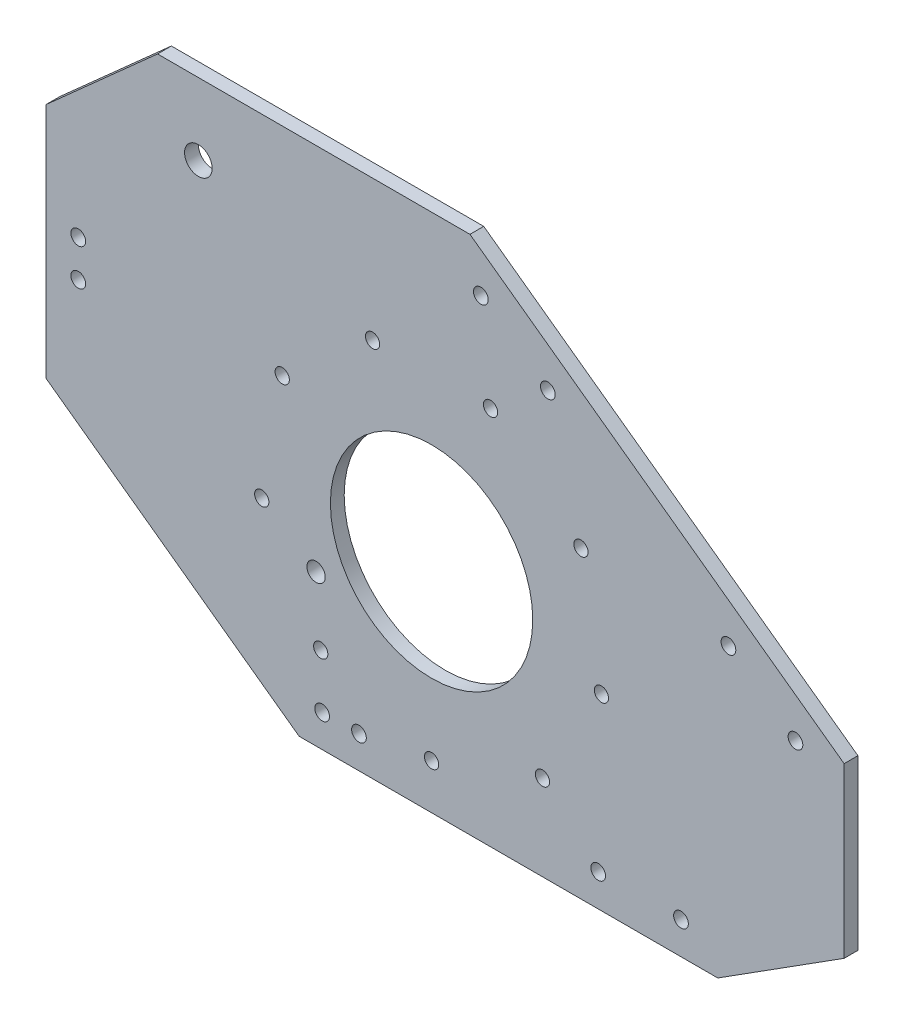
ISO-10303-21;
HEADER;
FILE_DESCRIPTION(('STEP AP214'),'2;1');
FILE_NAME('part.step','',(''),(''),'','','');
FILE_SCHEMA(('AUTOMOTIVE_DESIGN { 1 0 10303 214 1 1 1 1 }'));
ENDSEC;
DATA;
#1=APPLICATION_CONTEXT('core data for automotive mechanical design processes');
#2=APPLICATION_PROTOCOL_DEFINITION('international standard','automotive_design',2000,#1);
#3=PRODUCT_CONTEXT('',#1,'mechanical');
#4=PRODUCT('Part','Part','',(#3));
#5=PRODUCT_RELATED_PRODUCT_CATEGORY('part','',(#4));
#6=PRODUCT_DEFINITION_FORMATION('','',#4);
#7=PRODUCT_DEFINITION_CONTEXT('part definition',#1,'design');
#8=PRODUCT_DEFINITION('design','',#6,#7);
#9=PRODUCT_DEFINITION_SHAPE('','',#8);
#10=(LENGTH_UNIT() NAMED_UNIT(*) SI_UNIT(.MILLI.,.METRE.));
#11=(NAMED_UNIT(*) PLANE_ANGLE_UNIT() SI_UNIT($,.RADIAN.));
#12=(NAMED_UNIT(*) SI_UNIT($,.STERADIAN.) SOLID_ANGLE_UNIT());
#13=UNCERTAINTY_MEASURE_WITH_UNIT(LENGTH_MEASURE(1.E-05),#10,'distance_accuracy_value','');
#14=(GEOMETRIC_REPRESENTATION_CONTEXT(3) GLOBAL_UNCERTAINTY_ASSIGNED_CONTEXT((#13)) GLOBAL_UNIT_ASSIGNED_CONTEXT((#10,
#11,#12)) REPRESENTATION_CONTEXT('',''));
#15=CARTESIAN_POINT('',(0.,0.,0.));
#16=DIRECTION('',(0.,0.,1.));
#17=DIRECTION('',(1.,0.,0.));
#18=AXIS2_PLACEMENT_3D('',#15,#16,#17);
#19=CARTESIAN_POINT('',(0.,0.,-50.1117165948132));
#20=DIRECTION('',(0.,0.,-1.));
#21=DIRECTION('',(-1.,0.,0.));
#22=AXIS2_PLACEMENT_3D('',#19,#20,#21);
#23=PLANE('',#22);
#24=CARTESIAN_POINT('',(-12.8155102632688,9.25915524788277,-50.1117165948132));
#25=DIRECTION('',(0.,0.,-1.));
#26=DIRECTION('',(-1.,0.,0.));
#27=AXIS2_PLACEMENT_3D('',#24,#25,#26);
#28=CIRCLE('',#27,1.6);
#29=CARTESIAN_POINT('',(-14.4155102632688,9.25915524788277,-50.1117165948132));
#30=VERTEX_POINT('',#29);
#31=EDGE_CURVE('E390',#30,#30,#28,.T.);
#32=ORIENTED_EDGE('',*,*,#31,.F.);
#33=EDGE_LOOP('',(#32));
#34=FACE_BOUND('',#33,.T.);
#35=CARTESIAN_POINT('',(-20.8155102632688,9.25915524788277,-50.1117165948132));
#36=DIRECTION('',(0.,0.,-1.));
#37=DIRECTION('',(-1.,0.,0.));
#38=AXIS2_PLACEMENT_3D('',#35,#36,#37);
#39=CIRCLE('',#38,1.6);
#40=CARTESIAN_POINT('',(-22.4155102632688,9.25915524788277,-50.1117165948132));
#41=VERTEX_POINT('',#40);
#42=EDGE_CURVE('E386',#41,#41,#39,.T.);
#43=ORIENTED_EDGE('',*,*,#42,.F.);
#44=EDGE_LOOP('',(#43));
#45=FACE_BOUND('',#44,.T.);
#46=CARTESIAN_POINT('',(82.0999463845966,55.3937330616579,-50.1117165948132));
#47=DIRECTION('',(0.,0.,-1.));
#48=DIRECTION('',(-1.,0.,0.));
#49=AXIS2_PLACEMENT_3D('',#46,#47,#48);
#50=CIRCLE('',#49,1.60000000000001);
#51=CARTESIAN_POINT('',(80.4999463845966,55.3937330616579,-50.1117165948132));
#52=VERTEX_POINT('',#51);
#53=EDGE_CURVE('E375',#52,#52,#50,.T.);
#54=ORIENTED_EDGE('',*,*,#53,.F.);
#55=EDGE_LOOP('',(#54));
#56=FACE_BOUND('',#55,.T.);
#57=CARTESIAN_POINT('',(67.5275152985397,65.959917436451,-50.1117165948132));
#58=DIRECTION('',(0.,0.,-1.));
#59=DIRECTION('',(-1.,0.,0.));
#60=AXIS2_PLACEMENT_3D('',#57,#58,#59);
#61=CIRCLE('',#60,1.60000000000001);
#62=CARTESIAN_POINT('',(65.9275152985397,65.959917436451,-50.1117165948132));
#63=VERTEX_POINT('',#62);
#64=EDGE_CURVE('E371',#63,#63,#61,.T.);
#65=ORIENTED_EDGE('',*,*,#64,.F.);
#66=EDGE_LOOP('',(#65));
#67=FACE_BOUND('',#66,.T.);
#68=CARTESIAN_POINT('',(28.2620541972344,94.4305342544385,-50.1117165948132));
#69=DIRECTION('',(0.,0.,-1.));
#70=DIRECTION('',(-1.,0.,0.));
#71=AXIS2_PLACEMENT_3D('',#68,#69,#70);
#72=CIRCLE('',#71,1.6);
#73=CARTESIAN_POINT('',(26.6620541972344,94.4305342544385,-50.1117165948132));
#74=VERTEX_POINT('',#73);
#75=EDGE_CURVE('E363',#74,#74,#72,.T.);
#76=ORIENTED_EDGE('',*,*,#75,.F.);
#77=EDGE_LOOP('',(#76));
#78=FACE_BOUND('',#77,.T.);
#79=CARTESIAN_POINT('',(13.6896231111775,104.996718629232,-50.1117165948132));
#80=DIRECTION('',(0.,0.,-1.));
#81=DIRECTION('',(-1.,0.,0.));
#82=AXIS2_PLACEMENT_3D('',#79,#80,#81);
#83=CIRCLE('',#82,1.6);
#84=CARTESIAN_POINT('',(12.0896231111775,104.996718629232,-50.1117165948132));
#85=VERTEX_POINT('',#84);
#86=EDGE_CURVE('E354',#85,#85,#83,.T.);
#87=ORIENTED_EDGE('',*,*,#86,.F.);
#88=EDGE_LOOP('',(#87));
#89=FACE_BOUND('',#88,.T.);
#90=CARTESIAN_POINT('',(-73.8480972320264,72.2182566094569,-50.1117165948132));
#91=DIRECTION('',(0.,0.,-1.));
#92=DIRECTION('',(-1.,0.,0.));
#93=AXIS2_PLACEMENT_3D('',#90,#91,#92);
#94=CIRCLE('',#93,1.60000000000001);
#95=CARTESIAN_POINT('',(-75.4480972320264,72.2182566094569,-50.1117165948132));
#96=VERTEX_POINT('',#95);
#97=EDGE_CURVE('E343',#96,#96,#94,.T.);
#98=ORIENTED_EDGE('',*,*,#97,.F.);
#99=EDGE_LOOP('',(#98));
#100=FACE_BOUND('',#99,.T.);
#101=CARTESIAN_POINT('',(-73.8480972320264,64.2182566094569,-50.1117165948132));
#102=DIRECTION('',(0.,0.,-1.));
#103=DIRECTION('',(-1.,0.,0.));
#104=AXIS2_PLACEMENT_3D('',#101,#102,#103);
#105=CIRCLE('',#104,1.60000000000001);
#106=CARTESIAN_POINT('',(-75.4480972320264,64.2182566094569,-50.1117165948132));
#107=VERTEX_POINT('',#106);
#108=EDGE_CURVE('E338',#107,#107,#105,.T.);
#109=ORIENTED_EDGE('',*,*,#108,.F.);
#110=EDGE_LOOP('',(#109));
#111=FACE_BOUND('',#110,.T.);
#112=CARTESIAN_POINT('',(-33.9536941492373,43.0627713366464,-50.1117165948132));
#113=DIRECTION('',(0.,0.,-1.));
#114=DIRECTION('',(-1.,0.,0.));
#115=AXIS2_PLACEMENT_3D('',#112,#113,#114);
#116=CIRCLE('',#115,1.5503360640483);
#117=CARTESIAN_POINT('',(-35.5040302132856,43.0627713366464,-50.1117165948132));
#118=VERTEX_POINT('',#117);
#119=EDGE_CURVE('E290',#118,#118,#116,.T.);
#120=ORIENTED_EDGE('',*,*,#119,.F.);
#121=EDGE_LOOP('',(#120));
#122=FACE_BOUND('',#121,.T.);
#123=CARTESIAN_POINT('',(-29.4991855871602,68.3236111641728,-50.1117165948132));
#124=DIRECTION('',(0.,0.,-1.));
#125=DIRECTION('',(-1.,0.,0.));
#126=AXIS2_PLACEMENT_3D('',#123,#124,#125);
#127=CIRCLE('',#126,1.55033606404831);
#128=CARTESIAN_POINT('',(-31.0495216512085,68.3236111641728,-50.1117165948132));
#129=VERTEX_POINT('',#128);
#130=EDGE_CURVE('E299',#129,#129,#127,.T.);
#131=ORIENTED_EDGE('',*,*,#130,.F.);
#132=EDGE_LOOP('',(#131));
#133=FACE_BOUND('',#132,.T.);
#134=CARTESIAN_POINT('',(-9.84898831995296,84.812084443644,-50.1117165948132));
#135=DIRECTION('',(0.,0.,-1.));
#136=DIRECTION('',(-1.,0.,0.));
#137=AXIS2_PLACEMENT_3D('',#134,#135,#136);
#138=CIRCLE('',#137,1.55033606404831);
#139=CARTESIAN_POINT('',(-11.3993243840013,84.812084443644,-50.1117165948132));
#140=VERTEX_POINT('',#139);
#141=EDGE_CURVE('E307',#140,#140,#138,.T.);
#142=ORIENTED_EDGE('',*,*,#141,.F.);
#143=EDGE_LOOP('',(#142));
#144=FACE_BOUND('',#143,.T.);
#145=CARTESIAN_POINT('',(15.8025224294753,84.8120844436449,-50.1117165948132));
#146=DIRECTION('',(0.,0.,-1.));
#147=DIRECTION('',(-1.,0.,0.));
#148=AXIS2_PLACEMENT_3D('',#145,#146,#147);
#149=CIRCLE('',#148,1.55033606404831);
#150=CARTESIAN_POINT('',(14.252186365427,84.8120844436449,-50.1117165948132));
#151=VERTEX_POINT('',#150);
#152=EDGE_CURVE('E259',#151,#151,#149,.T.);
#153=ORIENTED_EDGE('',*,*,#152,.F.);
#154=EDGE_LOOP('',(#153));
#155=FACE_BOUND('',#154,.T.);
#156=CARTESIAN_POINT('',(35.4527196966758,68.3236111641708,-50.1117165948132));
#157=DIRECTION('',(0.,0.,-1.));
#158=DIRECTION('',(-1.,0.,0.));
#159=AXIS2_PLACEMENT_3D('',#156,#157,#158);
#160=CIRCLE('',#159,1.55033606404831);
#161=CARTESIAN_POINT('',(33.9023836326275,68.3236111641708,-50.1117165948132));
#162=VERTEX_POINT('',#161);
#163=EDGE_CURVE('E258',#162,#162,#160,.T.);
#164=ORIENTED_EDGE('',*,*,#163,.F.);
#165=EDGE_LOOP('',(#164));
#166=FACE_BOUND('',#165,.T.);
#167=CARTESIAN_POINT('',(39.9070577927147,43.061804501661,-50.1117165948132));
#168=DIRECTION('',(0.,0.,-1.));
#169=DIRECTION('',(-1.,0.,0.));
#170=AXIS2_PLACEMENT_3D('',#167,#168,#169);
#171=CIRCLE('',#170,1.55033606404832);
#172=CARTESIAN_POINT('',(38.3567217286664,43.061804501661,-50.1117165948132));
#173=VERTEX_POINT('',#172);
#174=EDGE_CURVE('E267',#173,#173,#171,.T.);
#175=ORIENTED_EDGE('',*,*,#174,.F.);
#176=EDGE_LOOP('',(#175));
#177=FACE_BOUND('',#176,.T.);
#178=CARTESIAN_POINT('',(27.0813024180058,20.8469445472107,-50.1117165948132));
#179=DIRECTION('',(0.,0.,-1.));
#180=DIRECTION('',(-1.,0.,0.));
#181=AXIS2_PLACEMENT_3D('',#178,#179,#180);
#182=CIRCLE('',#181,1.55033606404831);
#183=CARTESIAN_POINT('',(25.5309663539575,20.8469445472107,-50.1117165948132));
#184=VERTEX_POINT('',#183);
#185=EDGE_CURVE('E275',#184,#184,#182,.T.);
#186=ORIENTED_EDGE('',*,*,#185,.F.);
#187=EDGE_LOOP('',(#186));
#188=FACE_BOUND('',#187,.T.);
#189=CARTESIAN_POINT('',(2.9767670547193,12.0736111641782,-50.1117165948132));
#190=DIRECTION('',(0.,0.,-1.));
#191=DIRECTION('',(-1.,0.,0.));
#192=AXIS2_PLACEMENT_3D('',#189,#190,#191);
#193=CIRCLE('',#192,1.55033606404831);
#194=CARTESIAN_POINT('',(1.42643099067099,12.0736111641782,-50.1117165948132));
#195=VERTEX_POINT('',#194);
#196=EDGE_CURVE('E250',#195,#195,#193,.T.);
#197=ORIENTED_EDGE('',*,*,#196,.F.);
#198=EDGE_LOOP('',(#197));
#199=FACE_BOUND('',#198,.T.);
#200=CARTESIAN_POINT('',(57.2049606735181,9.25915524788276,-50.1117165948132));
#201=DIRECTION('',(0.,0.,-1.));
#202=DIRECTION('',(-1.,0.,0.));
#203=AXIS2_PLACEMENT_3D('',#200,#201,#202);
#204=CIRCLE('',#203,1.6);
#205=CARTESIAN_POINT('',(55.6049606735181,9.25915524788276,-50.1117165948132));
#206=VERTEX_POINT('',#205);
#207=EDGE_CURVE('E291',#206,#206,#204,.T.);
#208=ORIENTED_EDGE('',*,*,#207,.F.);
#209=EDGE_LOOP('',(#208));
#210=FACE_BOUND('',#209,.T.);
#211=CARTESIAN_POINT('',(39.2049606735181,9.25915524788276,-50.1117165948132));
#212=DIRECTION('',(0.,0.,-1.));
#213=DIRECTION('',(-1.,0.,0.));
#214=AXIS2_PLACEMENT_3D('',#211,#212,#213);
#215=CIRCLE('',#214,1.6);
#216=CARTESIAN_POINT('',(37.6049606735181,9.25915524788276,-50.1117165948132));
#217=VERTEX_POINT('',#216);
#218=EDGE_CURVE('E322',#217,#217,#215,.T.);
#219=ORIENTED_EDGE('',*,*,#218,.F.);
#220=EDGE_LOOP('',(#219));
#221=FACE_BOUND('',#220,.T.);
#222=CARTESIAN_POINT('',(-21.1277683084835,20.8469445472107,-50.1117165948132));
#223=DIRECTION('',(0.,0.,-1.));
#224=DIRECTION('',(-1.,0.,0.));
#225=AXIS2_PLACEMENT_3D('',#222,#223,#224);
#226=CIRCLE('',#225,1.5503360640483);
#227=CARTESIAN_POINT('',(-22.6781043725318,20.8469445472107,-50.1117165948132));
#228=VERTEX_POINT('',#227);
#229=EDGE_CURVE('E246',#228,#228,#226,.T.);
#230=ORIENTED_EDGE('',*,*,#229,.F.);
#231=EDGE_LOOP('',(#230));
#232=FACE_BOUND('',#231,.T.);
#233=CARTESIAN_POINT('',(-47.7332329452381,99.7336111641753,-50.1117165948132));
#234=DIRECTION('',(0.,0.,-1.));
#235=DIRECTION('',(-1.,0.,0.));
#236=AXIS2_PLACEMENT_3D('',#233,#234,#235);
#237=CIRCLE('',#236,3.00000000000001);
#238=CARTESIAN_POINT('',(-50.7332329452381,99.7336111641753,-50.1117165948132));
#239=VERTEX_POINT('',#238);
#240=EDGE_CURVE('E238',#239,#239,#237,.T.);
#241=ORIENTED_EDGE('',*,*,#240,.F.);
#242=EDGE_LOOP('',(#241));
#243=FACE_BOUND('',#242,.T.);
#244=CARTESIAN_POINT('',(2.97676705476189,49.5736111641754,-50.1117165948132));
#245=DIRECTION('',(0.,0.,-1.));
#246=DIRECTION('',(-1.,0.,0.));
#247=AXIS2_PLACEMENT_3D('',#244,#245,#246);
#248=CIRCLE('',#247,22.);
#249=CARTESIAN_POINT('',(-19.0232329452381,49.5736111641754,-50.1117165948132));
#250=VERTEX_POINT('',#249);
#251=EDGE_CURVE('E157',#250,#250,#248,.T.);
#252=ORIENTED_EDGE('',*,*,#251,.F.);
#253=EDGE_LOOP('',(#252));
#254=FACE_BOUND('',#253,.T.);
#255=DIRECTION('',(0.809579504780941,-0.58701024304406,0.));
#256=VECTOR('',#255,1.);
#257=CARTESIAN_POINT('',(11.3220587742384,115.359857107051,-50.1117165948132));
#258=LINE('',#257,#256);
#259=CARTESIAN_POINT('',(11.3220587742384,115.359857107051,-50.1117165948132));
#260=VERTEX_POINT('',#259);
#261=CARTESIAN_POINT('',(92.6856541241525,56.364707650772,-50.1117165948132));
#262=VERTEX_POINT('',#261);
#263=EDGE_CURVE('E175',#260,#262,#258,.T.);
#264=ORIENTED_EDGE('',*,*,#263,.T.);
#265=DIRECTION('',(0.,-1.,0.));
#266=VECTOR('',#265,1.);
#267=CARTESIAN_POINT('',(92.6856541241525,56.364707650772,-50.1117165948132));
#268=LINE('',#267,#266);
#269=CARTESIAN_POINT('',(92.6856541241525,19.6988260915546,-50.1117165948132));
#270=VERTEX_POINT('',#269);
#271=EDGE_CURVE('E110',#262,#270,#268,.T.);
#272=ORIENTED_EDGE('',*,*,#271,.T.);
#273=DIRECTION('',(-0.844329420182934,-0.535824439731477,0.));
#274=VECTOR('',#273,1.);
#275=CARTESIAN_POINT('',(92.6856541241525,19.6988260915546,-50.1117165948132));
#276=LINE('',#275,#274);
#277=CARTESIAN_POINT('',(65.2049606735181,2.25915524788277,-50.1117165948132));
#278=VERTEX_POINT('',#277);
#279=EDGE_CURVE('E197',#270,#278,#276,.T.);
#280=ORIENTED_EDGE('',*,*,#279,.T.);
#281=DIRECTION('',(-1.,0.,0.));
#282=VECTOR('',#281,1.);
#283=CARTESIAN_POINT('',(65.2049606735181,2.25915524788277,-50.1117165948132));
#284=LINE('',#283,#282);
#285=CARTESIAN_POINT('',(-25.8155102632688,2.25915524788277,-50.1117165948132));
#286=VERTEX_POINT('',#285);
#287=EDGE_CURVE('E211',#278,#286,#284,.T.);
#288=ORIENTED_EDGE('',*,*,#287,.T.);
#289=DIRECTION('',(-0.809736570052635,0.586793564313204,0.));
#290=VECTOR('',#289,1.);
#291=CARTESIAN_POINT('',(-25.8155102632688,2.25915524788277,-50.1117165948132));
#292=LINE('',#291,#290);
#293=CARTESIAN_POINT('',(-80.8480972320265,42.139739940599,-50.1117165948132));
#294=VERTEX_POINT('',#293);
#295=EDGE_CURVE('E129',#286,#294,#292,.T.);
#296=ORIENTED_EDGE('',*,*,#295,.T.);
#297=DIRECTION('',(0.,1.,0.));
#298=VECTOR('',#297,1.);
#299=CARTESIAN_POINT('',(-80.8480972320265,93.7182566094569,-50.1117165948132));
#300=LINE('',#299,#298);
#301=CARTESIAN_POINT('',(-80.8480972320265,93.7182566094569,-50.1117165948132));
#302=VERTEX_POINT('',#301);
#303=EDGE_CURVE('E123',#294,#302,#300,.T.);
#304=ORIENTED_EDGE('',*,*,#303,.T.);
#305=DIRECTION('',(0.746058084317605,0.665880871345878,0.));
#306=VECTOR('',#305,1.);
#307=CARTESIAN_POINT('',(-56.6006804588615,115.359857107051,-50.1117165948132));
#308=LINE('',#307,#306);
#309=CARTESIAN_POINT('',(-56.6006804588615,115.359857107051,-50.1117165948132));
#310=VERTEX_POINT('',#309);
#311=EDGE_CURVE('E127',#302,#310,#308,.T.);
#312=ORIENTED_EDGE('',*,*,#311,.T.);
#313=DIRECTION('',(1.,0.,0.));
#314=VECTOR('',#313,1.);
#315=CARTESIAN_POINT('',(11.3220587742384,115.359857107051,-50.1117165948132));
#316=LINE('',#315,#314);
#317=EDGE_CURVE('E67',#310,#260,#316,.T.);
#318=ORIENTED_EDGE('',*,*,#317,.T.);
#319=EDGE_LOOP('',(#264,#272,#280,#288,#296,#304,#312,#318));
#320=FACE_BOUND('',#319,.T.);
#321=CARTESIAN_POINT('',(-22.1383176912497,35.0742139973809,-50.1117165948132));
#322=DIRECTION('',(0.,0.,-1.));
#323=DIRECTION('',(-1.,0.,0.));
#324=AXIS2_PLACEMENT_3D('',#321,#322,#323);
#325=CIRCLE('',#324,1.9999999999959);
#326=CARTESIAN_POINT('',(-24.1383176912456,35.0742139973809,-50.1117165948132));
#327=VERTEX_POINT('',#326);
#328=EDGE_CURVE('E226',#327,#327,#325,.T.);
#329=ORIENTED_EDGE('',*,*,#328,.F.);
#330=EDGE_LOOP('',(#329));
#331=FACE_BOUND('',#330,.T.);
#332=ADVANCED_FACE('F49',(#34,#45,#56,#67,#78,#89,#100,#111,#122,#133,#144,#155,#166,#177,#188,
#199,#210,#221,#232,#243,#254,#320,#331),#23,.T.);
#333=CARTESIAN_POINT('',(0.,0.,-47.1117165948132));
#334=DIRECTION('',(0.,0.,-1.));
#335=DIRECTION('',(-1.,0.,0.));
#336=AXIS2_PLACEMENT_3D('',#333,#334,#335);
#337=PLANE('',#336);
#338=CARTESIAN_POINT('',(-12.8155102632688,9.25915524788277,-47.1117165948132));
#339=DIRECTION('',(0.,0.,-1.));
#340=DIRECTION('',(-1.,0.,0.));
#341=AXIS2_PLACEMENT_3D('',#338,#339,#340);
#342=CIRCLE('',#341,1.6);
#343=CARTESIAN_POINT('',(-14.4155102632688,9.25915524788277,-47.1117165948132));
#344=VERTEX_POINT('',#343);
#345=EDGE_CURVE('E355',#344,#344,#342,.T.);
#346=ORIENTED_EDGE('',*,*,#345,.T.);
#347=EDGE_LOOP('',(#346));
#348=FACE_BOUND('',#347,.T.);
#349=CARTESIAN_POINT('',(-20.8155102632688,9.25915524788277,-47.1117165948132));
#350=DIRECTION('',(0.,0.,-1.));
#351=DIRECTION('',(-1.,0.,0.));
#352=AXIS2_PLACEMENT_3D('',#349,#350,#351);
#353=CIRCLE('',#352,1.6);
#354=CARTESIAN_POINT('',(-22.4155102632688,9.25915524788277,-47.1117165948132));
#355=VERTEX_POINT('',#354);
#356=EDGE_CURVE('E382',#355,#355,#353,.T.);
#357=ORIENTED_EDGE('',*,*,#356,.T.);
#358=EDGE_LOOP('',(#357));
#359=FACE_BOUND('',#358,.T.);
#360=CARTESIAN_POINT('',(82.0999463845966,55.3937330616579,-47.1117165948132));
#361=DIRECTION('',(0.,0.,-1.));
#362=DIRECTION('',(-1.,0.,0.));
#363=AXIS2_PLACEMENT_3D('',#360,#361,#362);
#364=CIRCLE('',#363,1.60000000000001);
#365=CARTESIAN_POINT('',(80.4999463845966,55.3937330616579,-47.1117165948132));
#366=VERTEX_POINT('',#365);
#367=EDGE_CURVE('E339',#366,#366,#364,.T.);
#368=ORIENTED_EDGE('',*,*,#367,.T.);
#369=EDGE_LOOP('',(#368));
#370=FACE_BOUND('',#369,.T.);
#371=CARTESIAN_POINT('',(67.5275152985397,65.959917436451,-47.1117165948132));
#372=DIRECTION('',(0.,0.,-1.));
#373=DIRECTION('',(-1.,0.,0.));
#374=AXIS2_PLACEMENT_3D('',#371,#372,#373);
#375=CIRCLE('',#374,1.60000000000001);
#376=CARTESIAN_POINT('',(65.9275152985397,65.959917436451,-47.1117165948132));
#377=VERTEX_POINT('',#376);
#378=EDGE_CURVE('E367',#377,#377,#375,.T.);
#379=ORIENTED_EDGE('',*,*,#378,.T.);
#380=EDGE_LOOP('',(#379));
#381=FACE_BOUND('',#380,.T.);
#382=CARTESIAN_POINT('',(28.2620541972344,94.4305342544385,-47.1117165948132));
#383=DIRECTION('',(0.,0.,-1.));
#384=DIRECTION('',(-1.,0.,0.));
#385=AXIS2_PLACEMENT_3D('',#382,#383,#384);
#386=CIRCLE('',#385,1.6);
#387=CARTESIAN_POINT('',(26.6620541972344,94.4305342544385,-47.1117165948132));
#388=VERTEX_POINT('',#387);
#389=EDGE_CURVE('E359',#388,#388,#386,.T.);
#390=ORIENTED_EDGE('',*,*,#389,.T.);
#391=EDGE_LOOP('',(#390));
#392=FACE_BOUND('',#391,.T.);
#393=CARTESIAN_POINT('',(13.6896231111775,104.996718629232,-47.1117165948132));
#394=DIRECTION('',(0.,0.,-1.));
#395=DIRECTION('',(-1.,0.,0.));
#396=AXIS2_PLACEMENT_3D('',#393,#394,#395);
#397=CIRCLE('',#396,1.6);
#398=CARTESIAN_POINT('',(12.0896231111775,104.996718629232,-47.1117165948132));
#399=VERTEX_POINT('',#398);
#400=EDGE_CURVE('E350',#399,#399,#397,.T.);
#401=ORIENTED_EDGE('',*,*,#400,.T.);
#402=EDGE_LOOP('',(#401));
#403=FACE_BOUND('',#402,.T.);
#404=CARTESIAN_POINT('',(-73.8480972320264,72.2182566094569,-47.1117165948132));
#405=DIRECTION('',(0.,0.,-1.));
#406=DIRECTION('',(-1.,0.,0.));
#407=AXIS2_PLACEMENT_3D('',#404,#405,#406);
#408=CIRCLE('',#407,1.60000000000001);
#409=CARTESIAN_POINT('',(-75.4480972320264,72.2182566094569,-47.1117165948132));
#410=VERTEX_POINT('',#409);
#411=EDGE_CURVE('E323',#410,#410,#408,.T.);
#412=ORIENTED_EDGE('',*,*,#411,.T.);
#413=EDGE_LOOP('',(#412));
#414=FACE_BOUND('',#413,.T.);
#415=CARTESIAN_POINT('',(-73.8480972320264,64.2182566094569,-47.1117165948132));
#416=DIRECTION('',(0.,0.,-1.));
#417=DIRECTION('',(-1.,0.,0.));
#418=AXIS2_PLACEMENT_3D('',#415,#416,#417);
#419=CIRCLE('',#418,1.60000000000001);
#420=CARTESIAN_POINT('',(-75.4480972320264,64.2182566094569,-47.1117165948132));
#421=VERTEX_POINT('',#420);
#422=EDGE_CURVE('E334',#421,#421,#419,.T.);
#423=ORIENTED_EDGE('',*,*,#422,.T.);
#424=EDGE_LOOP('',(#423));
#425=FACE_BOUND('',#424,.T.);
#426=CARTESIAN_POINT('',(-33.9536941492373,43.0627713366464,-47.1117165948132));
#427=DIRECTION('',(0.,0.,-1.));
#428=DIRECTION('',(-1.,0.,0.));
#429=AXIS2_PLACEMENT_3D('',#426,#427,#428);
#430=CIRCLE('',#429,1.5503360640483);
#431=CARTESIAN_POINT('',(-35.5040302132856,43.0627713366464,-47.1117165948132));
#432=VERTEX_POINT('',#431);
#433=EDGE_CURVE('E286',#432,#432,#430,.T.);
#434=ORIENTED_EDGE('',*,*,#433,.T.);
#435=EDGE_LOOP('',(#434));
#436=FACE_BOUND('',#435,.T.);
#437=CARTESIAN_POINT('',(-29.4991855871602,68.3236111641728,-47.1117165948132));
#438=DIRECTION('',(0.,0.,-1.));
#439=DIRECTION('',(-1.,0.,0.));
#440=AXIS2_PLACEMENT_3D('',#437,#438,#439);
#441=CIRCLE('',#440,1.55033606404831);
#442=CARTESIAN_POINT('',(-31.0495216512085,68.3236111641728,-47.1117165948132));
#443=VERTEX_POINT('',#442);
#444=EDGE_CURVE('E295',#443,#443,#441,.T.);
#445=ORIENTED_EDGE('',*,*,#444,.T.);
#446=EDGE_LOOP('',(#445));
#447=FACE_BOUND('',#446,.T.);
#448=CARTESIAN_POINT('',(-9.84898831995296,84.812084443644,-47.1117165948132));
#449=DIRECTION('',(0.,0.,-1.));
#450=DIRECTION('',(-1.,0.,0.));
#451=AXIS2_PLACEMENT_3D('',#448,#449,#450);
#452=CIRCLE('',#451,1.55033606404831);
#453=CARTESIAN_POINT('',(-11.3993243840013,84.812084443644,-47.1117165948132));
#454=VERTEX_POINT('',#453);
#455=EDGE_CURVE('E303',#454,#454,#452,.T.);
#456=ORIENTED_EDGE('',*,*,#455,.T.);
#457=EDGE_LOOP('',(#456));
#458=FACE_BOUND('',#457,.T.);
#459=CARTESIAN_POINT('',(15.8025224294753,84.8120844436449,-47.1117165948132));
#460=DIRECTION('',(0.,0.,-1.));
#461=DIRECTION('',(-1.,0.,0.));
#462=AXIS2_PLACEMENT_3D('',#459,#460,#461);
#463=CIRCLE('',#462,1.55033606404831);
#464=CARTESIAN_POINT('',(14.252186365427,84.8120844436449,-47.1117165948132));
#465=VERTEX_POINT('',#464);
#466=EDGE_CURVE('E311',#465,#465,#463,.T.);
#467=ORIENTED_EDGE('',*,*,#466,.T.);
#468=EDGE_LOOP('',(#467));
#469=FACE_BOUND('',#468,.T.);
#470=CARTESIAN_POINT('',(35.4527196966758,68.3236111641708,-47.1117165948132));
#471=DIRECTION('',(0.,0.,-1.));
#472=DIRECTION('',(-1.,0.,0.));
#473=AXIS2_PLACEMENT_3D('',#470,#471,#472);
#474=CIRCLE('',#473,1.55033606404831);
#475=CARTESIAN_POINT('',(33.9023836326275,68.3236111641708,-47.1117165948132));
#476=VERTEX_POINT('',#475);
#477=EDGE_CURVE('E254',#476,#476,#474,.T.);
#478=ORIENTED_EDGE('',*,*,#477,.T.);
#479=EDGE_LOOP('',(#478));
#480=FACE_BOUND('',#479,.T.);
#481=CARTESIAN_POINT('',(39.9070577927147,43.061804501661,-47.1117165948132));
#482=DIRECTION('',(0.,0.,-1.));
#483=DIRECTION('',(-1.,0.,0.));
#484=AXIS2_PLACEMENT_3D('',#481,#482,#483);
#485=CIRCLE('',#484,1.55033606404832);
#486=CARTESIAN_POINT('',(38.3567217286664,43.061804501661,-47.1117165948132));
#487=VERTEX_POINT('',#486);
#488=EDGE_CURVE('E263',#487,#487,#485,.T.);
#489=ORIENTED_EDGE('',*,*,#488,.T.);
#490=EDGE_LOOP('',(#489));
#491=FACE_BOUND('',#490,.T.);
#492=CARTESIAN_POINT('',(27.0813024180058,20.8469445472107,-47.1117165948132));
#493=DIRECTION('',(0.,0.,-1.));
#494=DIRECTION('',(-1.,0.,0.));
#495=AXIS2_PLACEMENT_3D('',#492,#493,#494);
#496=CIRCLE('',#495,1.55033606404831);
#497=CARTESIAN_POINT('',(25.5309663539575,20.8469445472107,-47.1117165948132));
#498=VERTEX_POINT('',#497);
#499=EDGE_CURVE('E271',#498,#498,#496,.T.);
#500=ORIENTED_EDGE('',*,*,#499,.T.);
#501=EDGE_LOOP('',(#500));
#502=FACE_BOUND('',#501,.T.);
#503=CARTESIAN_POINT('',(2.9767670547193,12.0736111641782,-47.1117165948132));
#504=DIRECTION('',(0.,0.,-1.));
#505=DIRECTION('',(-1.,0.,0.));
#506=AXIS2_PLACEMENT_3D('',#503,#504,#505);
#507=CIRCLE('',#506,1.55033606404831);
#508=CARTESIAN_POINT('',(1.42643099067099,12.0736111641782,-47.1117165948132));
#509=VERTEX_POINT('',#508);
#510=EDGE_CURVE('E279',#509,#509,#507,.T.);
#511=ORIENTED_EDGE('',*,*,#510,.T.);
#512=EDGE_LOOP('',(#511));
#513=FACE_BOUND('',#512,.T.);
#514=CARTESIAN_POINT('',(57.2049606735181,9.25915524788276,-47.1117165948132));
#515=DIRECTION('',(0.,0.,-1.));
#516=DIRECTION('',(-1.,0.,0.));
#517=AXIS2_PLACEMENT_3D('',#514,#515,#516);
#518=CIRCLE('',#517,1.6);
#519=CARTESIAN_POINT('',(55.6049606735181,9.25915524788276,-47.1117165948132));
#520=VERTEX_POINT('',#519);
#521=EDGE_CURVE('E327',#520,#520,#518,.T.);
#522=ORIENTED_EDGE('',*,*,#521,.T.);
#523=EDGE_LOOP('',(#522));
#524=FACE_BOUND('',#523,.T.);
#525=CARTESIAN_POINT('',(39.2049606735181,9.25915524788276,-47.1117165948132));
#526=DIRECTION('',(0.,0.,-1.));
#527=DIRECTION('',(-1.,0.,0.));
#528=AXIS2_PLACEMENT_3D('',#525,#526,#527);
#529=CIRCLE('',#528,1.6);
#530=CARTESIAN_POINT('',(37.6049606735181,9.25915524788276,-47.1117165948132));
#531=VERTEX_POINT('',#530);
#532=EDGE_CURVE('E318',#531,#531,#529,.T.);
#533=ORIENTED_EDGE('',*,*,#532,.T.);
#534=EDGE_LOOP('',(#533));
#535=FACE_BOUND('',#534,.T.);
#536=CARTESIAN_POINT('',(-21.1277683084835,20.8469445472107,-47.1117165948132));
#537=DIRECTION('',(0.,0.,-1.));
#538=DIRECTION('',(-1.,0.,0.));
#539=AXIS2_PLACEMENT_3D('',#536,#537,#538);
#540=CIRCLE('',#539,1.5503360640483);
#541=CARTESIAN_POINT('',(-22.6781043725318,20.8469445472107,-47.1117165948132));
#542=VERTEX_POINT('',#541);
#543=EDGE_CURVE('E242',#542,#542,#540,.T.);
#544=ORIENTED_EDGE('',*,*,#543,.T.);
#545=EDGE_LOOP('',(#544));
#546=FACE_BOUND('',#545,.T.);
#547=CARTESIAN_POINT('',(-47.7332329452381,99.7336111641753,-47.1117165948132));
#548=DIRECTION('',(0.,0.,-1.));
#549=DIRECTION('',(-1.,0.,0.));
#550=AXIS2_PLACEMENT_3D('',#547,#548,#549);
#551=CIRCLE('',#550,3.00000000000001);
#552=CARTESIAN_POINT('',(-50.7332329452381,99.7336111641753,-47.1117165948132));
#553=VERTEX_POINT('',#552);
#554=EDGE_CURVE('E234',#553,#553,#551,.T.);
#555=ORIENTED_EDGE('',*,*,#554,.T.);
#556=EDGE_LOOP('',(#555));
#557=FACE_BOUND('',#556,.T.);
#558=DIRECTION('',(0.809579504780941,-0.58701024304406,0.));
#559=VECTOR('',#558,1.);
#560=CARTESIAN_POINT('',(11.3220587742384,115.359857107051,-47.1117165948132));
#561=LINE('',#560,#559);
#562=CARTESIAN_POINT('',(11.3220587742384,115.359857107051,-47.1117165948132));
#563=VERTEX_POINT('',#562);
#564=CARTESIAN_POINT('',(92.6856541241525,56.364707650772,-47.1117165948132));
#565=VERTEX_POINT('',#564);
#566=EDGE_CURVE('E152',#563,#565,#561,.T.);
#567=ORIENTED_EDGE('',*,*,#566,.F.);
#568=DIRECTION('',(1.,0.,0.));
#569=VECTOR('',#568,1.);
#570=CARTESIAN_POINT('',(11.3220587742384,115.359857107051,-47.1117165948132));
#571=LINE('',#570,#569);
#572=CARTESIAN_POINT('',(-56.6006804588615,115.359857107051,-47.1117165948132));
#573=VERTEX_POINT('',#572);
#574=EDGE_CURVE('E102',#573,#563,#571,.T.);
#575=ORIENTED_EDGE('',*,*,#574,.F.);
#576=DIRECTION('',(0.746058084317605,0.665880871345878,0.));
#577=VECTOR('',#576,1.);
#578=CARTESIAN_POINT('',(-56.6006804588615,115.359857107051,-47.1117165948132));
#579=LINE('',#578,#577);
#580=CARTESIAN_POINT('',(-80.8480972320265,93.7182566094569,-47.1117165948132));
#581=VERTEX_POINT('',#580);
#582=EDGE_CURVE('E96',#581,#573,#579,.T.);
#583=ORIENTED_EDGE('',*,*,#582,.F.);
#584=DIRECTION('',(0.,1.,0.));
#585=VECTOR('',#584,1.);
#586=CARTESIAN_POINT('',(-80.8480972320265,93.7182566094569,-47.1117165948132));
#587=LINE('',#586,#585);
#588=CARTESIAN_POINT('',(-80.8480972320265,42.139739940599,-47.1117165948132));
#589=VERTEX_POINT('',#588);
#590=EDGE_CURVE('E138',#589,#581,#587,.T.);
#591=ORIENTED_EDGE('',*,*,#590,.F.);
#592=DIRECTION('',(-0.809736570052635,0.586793564313204,0.));
#593=VECTOR('',#592,1.);
#594=CARTESIAN_POINT('',(-25.8155102632688,2.25915524788277,-47.1117165948132));
#595=LINE('',#594,#593);
#596=CARTESIAN_POINT('',(-25.8155102632688,2.25915524788277,-47.1117165948132));
#597=VERTEX_POINT('',#596);
#598=EDGE_CURVE('E166',#597,#589,#595,.T.);
#599=ORIENTED_EDGE('',*,*,#598,.F.);
#600=DIRECTION('',(-1.,0.,0.));
#601=VECTOR('',#600,1.);
#602=CARTESIAN_POINT('',(65.2049606735181,2.25915524788277,-47.1117165948132));
#603=LINE('',#602,#601);
#604=CARTESIAN_POINT('',(65.2049606735181,2.25915524788277,-47.1117165948132));
#605=VERTEX_POINT('',#604);
#606=EDGE_CURVE('E163',#605,#597,#603,.T.);
#607=ORIENTED_EDGE('',*,*,#606,.F.);
#608=DIRECTION('',(-0.844329420182934,-0.535824439731477,0.));
#609=VECTOR('',#608,1.);
#610=CARTESIAN_POINT('',(92.6856541241525,19.6988260915546,-47.1117165948132));
#611=LINE('',#610,#609);
#612=CARTESIAN_POINT('',(92.6856541241525,19.6988260915546,-47.1117165948132));
#613=VERTEX_POINT('',#612);
#614=EDGE_CURVE('E160',#613,#605,#611,.T.);
#615=ORIENTED_EDGE('',*,*,#614,.F.);
#616=DIRECTION('',(0.,-1.,0.));
#617=VECTOR('',#616,1.);
#618=CARTESIAN_POINT('',(92.6856541241525,56.364707650772,-47.1117165948132));
#619=LINE('',#618,#617);
#620=EDGE_CURVE('E156',#565,#613,#619,.T.);
#621=ORIENTED_EDGE('',*,*,#620,.F.);
#622=EDGE_LOOP('',(#567,#575,#583,#591,#599,#607,#615,#621));
#623=FACE_BOUND('',#622,.T.);
#624=CARTESIAN_POINT('',(2.97676705476189,49.5736111641754,-47.1117165948132));
#625=DIRECTION('',(0.,0.,-1.));
#626=DIRECTION('',(-1.,0.,0.));
#627=AXIS2_PLACEMENT_3D('',#624,#625,#626);
#628=CIRCLE('',#627,22.);
#629=CARTESIAN_POINT('',(-19.0232329452381,49.5736111641754,-47.1117165948132));
#630=VERTEX_POINT('',#629);
#631=EDGE_CURVE('E222',#630,#630,#628,.T.);
#632=ORIENTED_EDGE('',*,*,#631,.T.);
#633=EDGE_LOOP('',(#632));
#634=FACE_BOUND('',#633,.T.);
#635=CARTESIAN_POINT('',(-22.1383176912497,35.0742139973809,-47.1117165948132));
#636=DIRECTION('',(0.,0.,-1.));
#637=DIRECTION('',(-1.,0.,0.));
#638=AXIS2_PLACEMENT_3D('',#635,#636,#637);
#639=CIRCLE('',#638,1.9999999999959);
#640=CARTESIAN_POINT('',(-24.1383176912456,35.0742139973809,-47.1117165948132));
#641=VERTEX_POINT('',#640);
#642=EDGE_CURVE('E230',#641,#641,#639,.T.);
#643=ORIENTED_EDGE('',*,*,#642,.T.);
#644=EDGE_LOOP('',(#643));
#645=FACE_BOUND('',#644,.T.);
#646=ADVANCED_FACE('F201',(#348,#359,#370,#381,#392,#403,#414,#425,#436,#447,#458,#469,#480,
#491,#502,#513,#524,#535,#546,#557,#623,#634,#645),#337,.F.);
#647=CARTESIAN_POINT('',(11.3220587742384,115.359857107051,-50.1117165948132));
#648=DIRECTION('',(-0.58701024304406,-0.809579504780941,0.));
#649=DIRECTION('',(0.809579504780941,-0.58701024304406,0.));
#650=AXIS2_PLACEMENT_3D('',#647,#648,#649);
#651=PLANE('',#650);
#652=ORIENTED_EDGE('',*,*,#566,.T.);
#653=DIRECTION('',(0.,0.,1.));
#654=VECTOR('',#653,1.);
#655=CARTESIAN_POINT('',(92.6856541241525,56.364707650772,-50.1117165948132));
#656=LINE('',#655,#654);
#657=EDGE_CURVE('E11',#262,#565,#656,.T.);
#658=ORIENTED_EDGE('',*,*,#657,.F.);
#659=ORIENTED_EDGE('',*,*,#263,.F.);
#660=DIRECTION('',(0.,0.,1.));
#661=VECTOR('',#660,1.);
#662=CARTESIAN_POINT('',(11.3220587742384,115.359857107051,-50.1117165948132));
#663=LINE('',#662,#661);
#664=EDGE_CURVE('E148',#260,#563,#663,.T.);
#665=ORIENTED_EDGE('',*,*,#664,.T.);
#666=EDGE_LOOP('',(#652,#658,#659,#665));
#667=FACE_BOUND('',#666,.T.);
#668=ADVANCED_FACE('F51',(#667),#651,.F.);
#669=CARTESIAN_POINT('',(92.6856541241525,56.364707650772,-50.1117165948132));
#670=DIRECTION('',(-1.,0.,0.));
#671=DIRECTION('',(0.,0.,1.));
#672=AXIS2_PLACEMENT_3D('',#669,#670,#671);
#673=PLANE('',#672);
#674=ORIENTED_EDGE('',*,*,#620,.T.);
#675=DIRECTION('',(0.,0.,1.));
#676=VECTOR('',#675,1.);
#677=CARTESIAN_POINT('',(92.6856541241525,19.6988260915546,-50.1117165948132));
#678=LINE('',#677,#676);
#679=EDGE_CURVE('E59',#270,#613,#678,.T.);
#680=ORIENTED_EDGE('',*,*,#679,.F.);
#681=ORIENTED_EDGE('',*,*,#271,.F.);
#682=ORIENTED_EDGE('',*,*,#657,.T.);
#683=EDGE_LOOP('',(#674,#680,#681,#682));
#684=FACE_BOUND('',#683,.T.);
#685=ADVANCED_FACE('F486',(#684),#673,.F.);
#686=CARTESIAN_POINT('',(92.6856541241525,19.6988260915546,-50.1117165948132));
#687=DIRECTION('',(-0.535824439731477,0.844329420182934,0.));
#688=DIRECTION('',(-0.844329420182934,-0.535824439731477,0.));
#689=AXIS2_PLACEMENT_3D('',#686,#687,#688);
#690=PLANE('',#689);
#691=ORIENTED_EDGE('',*,*,#614,.T.);
#692=DIRECTION('',(0.,0.,1.));
#693=VECTOR('',#692,1.);
#694=CARTESIAN_POINT('',(65.2049606735181,2.25915524788277,-50.1117165948132));
#695=LINE('',#694,#693);
#696=EDGE_CURVE('E186',#278,#605,#695,.T.);
#697=ORIENTED_EDGE('',*,*,#696,.F.);
#698=ORIENTED_EDGE('',*,*,#279,.F.);
#699=ORIENTED_EDGE('',*,*,#679,.T.);
#700=EDGE_LOOP('',(#691,#697,#698,#699));
#701=FACE_BOUND('',#700,.T.);
#702=ADVANCED_FACE('F195',(#701),#690,.F.);
#703=CARTESIAN_POINT('',(65.2049606735181,2.25915524788277,-50.1117165948132));
#704=DIRECTION('',(0.,1.,0.));
#705=DIRECTION('',(0.,0.,1.));
#706=AXIS2_PLACEMENT_3D('',#703,#704,#705);
#707=PLANE('',#706);
#708=ORIENTED_EDGE('',*,*,#606,.T.);
#709=DIRECTION('',(0.,0.,1.));
#710=VECTOR('',#709,1.);
#711=CARTESIAN_POINT('',(-25.8155102632688,2.25915524788277,-50.1117165948132));
#712=LINE('',#711,#710);
#713=EDGE_CURVE('E182',#286,#597,#712,.T.);
#714=ORIENTED_EDGE('',*,*,#713,.F.);
#715=ORIENTED_EDGE('',*,*,#287,.F.);
#716=ORIENTED_EDGE('',*,*,#696,.T.);
#717=EDGE_LOOP('',(#708,#714,#715,#716));
#718=FACE_BOUND('',#717,.T.);
#719=ADVANCED_FACE('F206',(#718),#707,.F.);
#720=CARTESIAN_POINT('',(-25.8155102632688,2.25915524788277,-50.1117165948132));
#721=DIRECTION('',(0.586793564313204,0.809736570052635,0.));
#722=DIRECTION('',(-0.809736570052635,0.586793564313204,0.));
#723=AXIS2_PLACEMENT_3D('',#720,#721,#722);
#724=PLANE('',#723);
#725=ORIENTED_EDGE('',*,*,#598,.T.);
#726=DIRECTION('',(0.,0.,1.));
#727=VECTOR('',#726,1.);
#728=CARTESIAN_POINT('',(-80.8480972320265,42.139739940599,-50.1117165948132));
#729=LINE('',#728,#727);
#730=EDGE_CURVE('E140',#294,#589,#729,.T.);
#731=ORIENTED_EDGE('',*,*,#730,.F.);
#732=ORIENTED_EDGE('',*,*,#295,.F.);
#733=ORIENTED_EDGE('',*,*,#713,.T.);
#734=EDGE_LOOP('',(#725,#731,#732,#733));
#735=FACE_BOUND('',#734,.T.);
#736=ADVANCED_FACE('F209',(#735),#724,.F.);
#737=CARTESIAN_POINT('',(-80.8480972320265,93.7182566094569,-50.1117165948132));
#738=DIRECTION('',(1.,0.,0.));
#739=DIRECTION('',(0.,0.,-1.));
#740=AXIS2_PLACEMENT_3D('',#737,#738,#739);
#741=PLANE('',#740);
#742=ORIENTED_EDGE('',*,*,#590,.T.);
#743=DIRECTION('',(0.,0.,1.));
#744=VECTOR('',#743,1.);
#745=CARTESIAN_POINT('',(-80.8480972320265,93.7182566094569,-50.1117165948132));
#746=LINE('',#745,#744);
#747=EDGE_CURVE('E135',#302,#581,#746,.T.);
#748=ORIENTED_EDGE('',*,*,#747,.F.);
#749=ORIENTED_EDGE('',*,*,#303,.F.);
#750=ORIENTED_EDGE('',*,*,#730,.T.);
#751=EDGE_LOOP('',(#742,#748,#749,#750));
#752=FACE_BOUND('',#751,.T.);
#753=ADVANCED_FACE('F136',(#752),#741,.F.);
#754=CARTESIAN_POINT('',(-56.6006804588615,115.359857107051,-50.1117165948132));
#755=DIRECTION('',(0.665880871345878,-0.746058084317605,0.));
#756=DIRECTION('',(0.746058084317605,0.665880871345878,0.));
#757=AXIS2_PLACEMENT_3D('',#754,#755,#756);
#758=PLANE('',#757);
#759=ORIENTED_EDGE('',*,*,#582,.T.);
#760=DIRECTION('',(0.,0.,1.));
#761=VECTOR('',#760,1.);
#762=CARTESIAN_POINT('',(-56.6006804588615,115.359857107051,-50.1117165948132));
#763=LINE('',#762,#761);
#764=EDGE_CURVE('E141',#310,#573,#763,.T.);
#765=ORIENTED_EDGE('',*,*,#764,.F.);
#766=ORIENTED_EDGE('',*,*,#311,.F.);
#767=ORIENTED_EDGE('',*,*,#747,.T.);
#768=EDGE_LOOP('',(#759,#765,#766,#767));
#769=FACE_BOUND('',#768,.T.);
#770=ADVANCED_FACE('F143',(#769),#758,.F.);
#771=CARTESIAN_POINT('',(11.3220587742384,115.359857107051,-50.1117165948132));
#772=DIRECTION('',(0.,-1.,0.));
#773=DIRECTION('',(0.,0.,-1.));
#774=AXIS2_PLACEMENT_3D('',#771,#772,#773);
#775=PLANE('',#774);
#776=ORIENTED_EDGE('',*,*,#574,.T.);
#777=ORIENTED_EDGE('',*,*,#664,.F.);
#778=ORIENTED_EDGE('',*,*,#317,.F.);
#779=ORIENTED_EDGE('',*,*,#764,.T.);
#780=EDGE_LOOP('',(#776,#777,#778,#779));
#781=FACE_BOUND('',#780,.T.);
#782=ADVANCED_FACE('F455',(#781),#775,.F.);
#783=CARTESIAN_POINT('',(2.97676705476189,49.5736111641754,-50.1117165948132));
#784=DIRECTION('',(0.,0.,1.));
#785=DIRECTION('',(1.,0.,0.));
#786=AXIS2_PLACEMENT_3D('',#783,#784,#785);
#787=CYLINDRICAL_SURFACE('',#786,22.);
#788=ORIENTED_EDGE('',*,*,#251,.T.);
#789=EDGE_LOOP('',(#788));
#790=FACE_BOUND('',#789,.T.);
#791=ORIENTED_EDGE('',*,*,#631,.F.);
#792=EDGE_LOOP('',(#791));
#793=FACE_BOUND('',#792,.T.);
#794=ADVANCED_FACE('F451',(#790,#793),#787,.F.);
#795=CARTESIAN_POINT('',(-22.1383176912497,35.0742139973809,-50.1117165948132));
#796=DIRECTION('',(0.,0.,1.));
#797=DIRECTION('',(1.,0.,0.));
#798=AXIS2_PLACEMENT_3D('',#795,#796,#797);
#799=CYLINDRICAL_SURFACE('',#798,1.9999999999959);
#800=ORIENTED_EDGE('',*,*,#328,.T.);
#801=EDGE_LOOP('',(#800));
#802=FACE_BOUND('',#801,.T.);
#803=ORIENTED_EDGE('',*,*,#642,.F.);
#804=EDGE_LOOP('',(#803));
#805=FACE_BOUND('',#804,.T.);
#806=ADVANCED_FACE('F454',(#802,#805),#799,.F.);
#807=CARTESIAN_POINT('',(-47.7332329452381,99.7336111641753,-47.1117165948132));
#808=DIRECTION('',(0.,0.,-1.));
#809=DIRECTION('',(-1.,0.,0.));
#810=AXIS2_PLACEMENT_3D('',#807,#808,#809);
#811=CYLINDRICAL_SURFACE('',#810,3.00000000000001);
#812=ORIENTED_EDGE('',*,*,#554,.F.);
#813=EDGE_LOOP('',(#812));
#814=FACE_BOUND('',#813,.T.);
#815=ORIENTED_EDGE('',*,*,#240,.T.);
#816=EDGE_LOOP('',(#815));
#817=FACE_BOUND('',#816,.T.);
#818=ADVANCED_FACE('F464',(#814,#817),#811,.F.);
#819=CARTESIAN_POINT('',(-21.1277683084835,20.8469445472107,-47.1117165948132));
#820=DIRECTION('',(0.,0.,-1.));
#821=DIRECTION('',(-1.,0.,0.));
#822=AXIS2_PLACEMENT_3D('',#819,#820,#821);
#823=CYLINDRICAL_SURFACE('',#822,1.5503360640483);
#824=ORIENTED_EDGE('',*,*,#543,.F.);
#825=EDGE_LOOP('',(#824));
#826=FACE_BOUND('',#825,.T.);
#827=ORIENTED_EDGE('',*,*,#229,.T.);
#828=EDGE_LOOP('',(#827));
#829=FACE_BOUND('',#828,.T.);
#830=ADVANCED_FACE('F470',(#826,#829),#823,.F.);
#831=CARTESIAN_POINT('',(39.2049606735181,9.25915524788276,-47.1117165948132));
#832=DIRECTION('',(0.,0.,-1.));
#833=DIRECTION('',(-1.,0.,0.));
#834=AXIS2_PLACEMENT_3D('',#831,#832,#833);
#835=CYLINDRICAL_SURFACE('',#834,1.6);
#836=ORIENTED_EDGE('',*,*,#532,.F.);
#837=EDGE_LOOP('',(#836));
#838=FACE_BOUND('',#837,.T.);
#839=ORIENTED_EDGE('',*,*,#218,.T.);
#840=EDGE_LOOP('',(#839));
#841=FACE_BOUND('',#840,.T.);
#842=ADVANCED_FACE('F672',(#838,#841),#835,.F.);
#843=CARTESIAN_POINT('',(57.2049606735181,9.25915524788276,-47.1117165948132));
#844=DIRECTION('',(0.,0.,-1.));
#845=DIRECTION('',(-1.,0.,0.));
#846=AXIS2_PLACEMENT_3D('',#843,#844,#845);
#847=CYLINDRICAL_SURFACE('',#846,1.6);
#848=ORIENTED_EDGE('',*,*,#521,.F.);
#849=EDGE_LOOP('',(#848));
#850=FACE_BOUND('',#849,.T.);
#851=ORIENTED_EDGE('',*,*,#207,.T.);
#852=EDGE_LOOP('',(#851));
#853=FACE_BOUND('',#852,.T.);
#854=ADVANCED_FACE('F661',(#850,#853),#847,.F.);
#855=CARTESIAN_POINT('',(2.9767670547193,12.0736111641782,-47.1117165948132));
#856=DIRECTION('',(0.,0.,-1.));
#857=DIRECTION('',(-1.,0.,0.));
#858=AXIS2_PLACEMENT_3D('',#855,#856,#857);
#859=CYLINDRICAL_SURFACE('',#858,1.55033606404831);
#860=ORIENTED_EDGE('',*,*,#510,.F.);
#861=EDGE_LOOP('',(#860));
#862=FACE_BOUND('',#861,.T.);
#863=ORIENTED_EDGE('',*,*,#196,.T.);
#864=EDGE_LOOP('',(#863));
#865=FACE_BOUND('',#864,.T.);
#866=ADVANCED_FACE('F650',(#862,#865),#859,.F.);
#867=CARTESIAN_POINT('',(27.0813024180058,20.8469445472107,-47.1117165948132));
#868=DIRECTION('',(0.,0.,-1.));
#869=DIRECTION('',(-1.,0.,0.));
#870=AXIS2_PLACEMENT_3D('',#867,#868,#869);
#871=CYLINDRICAL_SURFACE('',#870,1.55033606404831);
#872=ORIENTED_EDGE('',*,*,#499,.F.);
#873=EDGE_LOOP('',(#872));
#874=FACE_BOUND('',#873,.T.);
#875=ORIENTED_EDGE('',*,*,#185,.T.);
#876=EDGE_LOOP('',(#875));
#877=FACE_BOUND('',#876,.T.);
#878=ADVANCED_FACE('F639',(#874,#877),#871,.F.);
#879=CARTESIAN_POINT('',(39.9070577927147,43.061804501661,-47.1117165948132));
#880=DIRECTION('',(0.,0.,-1.));
#881=DIRECTION('',(-1.,0.,0.));
#882=AXIS2_PLACEMENT_3D('',#879,#880,#881);
#883=CYLINDRICAL_SURFACE('',#882,1.55033606404832);
#884=ORIENTED_EDGE('',*,*,#488,.F.);
#885=EDGE_LOOP('',(#884));
#886=FACE_BOUND('',#885,.T.);
#887=ORIENTED_EDGE('',*,*,#174,.T.);
#888=EDGE_LOOP('',(#887));
#889=FACE_BOUND('',#888,.T.);
#890=ADVANCED_FACE('F628',(#886,#889),#883,.F.);
#891=CARTESIAN_POINT('',(35.4527196966758,68.3236111641708,-47.1117165948132));
#892=DIRECTION('',(0.,0.,-1.));
#893=DIRECTION('',(-1.,0.,0.));
#894=AXIS2_PLACEMENT_3D('',#891,#892,#893);
#895=CYLINDRICAL_SURFACE('',#894,1.55033606404831);
#896=ORIENTED_EDGE('',*,*,#477,.F.);
#897=EDGE_LOOP('',(#896));
#898=FACE_BOUND('',#897,.T.);
#899=ORIENTED_EDGE('',*,*,#163,.T.);
#900=EDGE_LOOP('',(#899));
#901=FACE_BOUND('',#900,.T.);
#902=ADVANCED_FACE('F617',(#898,#901),#895,.F.);
#903=CARTESIAN_POINT('',(15.8025224294753,84.8120844436449,-47.1117165948132));
#904=DIRECTION('',(0.,0.,-1.));
#905=DIRECTION('',(-1.,0.,0.));
#906=AXIS2_PLACEMENT_3D('',#903,#904,#905);
#907=CYLINDRICAL_SURFACE('',#906,1.55033606404831);
#908=ORIENTED_EDGE('',*,*,#466,.F.);
#909=EDGE_LOOP('',(#908));
#910=FACE_BOUND('',#909,.T.);
#911=ORIENTED_EDGE('',*,*,#152,.T.);
#912=EDGE_LOOP('',(#911));
#913=FACE_BOUND('',#912,.T.);
#914=ADVANCED_FACE('F606',(#910,#913),#907,.F.);
#915=CARTESIAN_POINT('',(-9.84898831995296,84.812084443644,-47.1117165948132));
#916=DIRECTION('',(0.,0.,-1.));
#917=DIRECTION('',(-1.,0.,0.));
#918=AXIS2_PLACEMENT_3D('',#915,#916,#917);
#919=CYLINDRICAL_SURFACE('',#918,1.55033606404831);
#920=ORIENTED_EDGE('',*,*,#455,.F.);
#921=EDGE_LOOP('',(#920));
#922=FACE_BOUND('',#921,.T.);
#923=ORIENTED_EDGE('',*,*,#141,.T.);
#924=EDGE_LOOP('',(#923));
#925=FACE_BOUND('',#924,.T.);
#926=ADVANCED_FACE('F595',(#922,#925),#919,.F.);
#927=CARTESIAN_POINT('',(-29.4991855871602,68.3236111641728,-47.1117165948132));
#928=DIRECTION('',(0.,0.,-1.));
#929=DIRECTION('',(-1.,0.,0.));
#930=AXIS2_PLACEMENT_3D('',#927,#928,#929);
#931=CYLINDRICAL_SURFACE('',#930,1.55033606404831);
#932=ORIENTED_EDGE('',*,*,#444,.F.);
#933=EDGE_LOOP('',(#932));
#934=FACE_BOUND('',#933,.T.);
#935=ORIENTED_EDGE('',*,*,#130,.T.);
#936=EDGE_LOOP('',(#935));
#937=FACE_BOUND('',#936,.T.);
#938=ADVANCED_FACE('F584',(#934,#937),#931,.F.);
#939=CARTESIAN_POINT('',(-33.9536941492373,43.0627713366464,-47.1117165948132));
#940=DIRECTION('',(0.,0.,-1.));
#941=DIRECTION('',(-1.,0.,0.));
#942=AXIS2_PLACEMENT_3D('',#939,#940,#941);
#943=CYLINDRICAL_SURFACE('',#942,1.5503360640483);
#944=ORIENTED_EDGE('',*,*,#433,.F.);
#945=EDGE_LOOP('',(#944));
#946=FACE_BOUND('',#945,.T.);
#947=ORIENTED_EDGE('',*,*,#119,.T.);
#948=EDGE_LOOP('',(#947));
#949=FACE_BOUND('',#948,.T.);
#950=ADVANCED_FACE('F573',(#946,#949),#943,.F.);
#951=CARTESIAN_POINT('',(-73.8480972320264,64.2182566094569,-47.1117165948132));
#952=DIRECTION('',(0.,0.,-1.));
#953=DIRECTION('',(-1.,0.,0.));
#954=AXIS2_PLACEMENT_3D('',#951,#952,#953);
#955=CYLINDRICAL_SURFACE('',#954,1.60000000000001);
#956=ORIENTED_EDGE('',*,*,#422,.F.);
#957=EDGE_LOOP('',(#956));
#958=FACE_BOUND('',#957,.T.);
#959=ORIENTED_EDGE('',*,*,#108,.T.);
#960=EDGE_LOOP('',(#959));
#961=FACE_BOUND('',#960,.T.);
#962=ADVANCED_FACE('F562',(#958,#961),#955,.F.);
#963=CARTESIAN_POINT('',(-73.8480972320264,72.2182566094569,-47.1117165948132));
#964=DIRECTION('',(0.,0.,-1.));
#965=DIRECTION('',(-1.,0.,0.));
#966=AXIS2_PLACEMENT_3D('',#963,#964,#965);
#967=CYLINDRICAL_SURFACE('',#966,1.60000000000001);
#968=ORIENTED_EDGE('',*,*,#411,.F.);
#969=EDGE_LOOP('',(#968));
#970=FACE_BOUND('',#969,.T.);
#971=ORIENTED_EDGE('',*,*,#97,.T.);
#972=EDGE_LOOP('',(#971));
#973=FACE_BOUND('',#972,.T.);
#974=ADVANCED_FACE('F551',(#970,#973),#967,.F.);
#975=CARTESIAN_POINT('',(13.6896231111775,104.996718629232,-47.1117165948132));
#976=DIRECTION('',(0.,0.,-1.));
#977=DIRECTION('',(-1.,0.,0.));
#978=AXIS2_PLACEMENT_3D('',#975,#976,#977);
#979=CYLINDRICAL_SURFACE('',#978,1.6);
#980=ORIENTED_EDGE('',*,*,#400,.F.);
#981=EDGE_LOOP('',(#980));
#982=FACE_BOUND('',#981,.T.);
#983=ORIENTED_EDGE('',*,*,#86,.T.);
#984=EDGE_LOOP('',(#983));
#985=FACE_BOUND('',#984,.T.);
#986=ADVANCED_FACE('F540',(#982,#985),#979,.F.);
#987=CARTESIAN_POINT('',(28.2620541972344,94.4305342544385,-47.1117165948132));
#988=DIRECTION('',(0.,0.,-1.));
#989=DIRECTION('',(-1.,0.,0.));
#990=AXIS2_PLACEMENT_3D('',#987,#988,#989);
#991=CYLINDRICAL_SURFACE('',#990,1.6);
#992=ORIENTED_EDGE('',*,*,#389,.F.);
#993=EDGE_LOOP('',(#992));
#994=FACE_BOUND('',#993,.T.);
#995=ORIENTED_EDGE('',*,*,#75,.T.);
#996=EDGE_LOOP('',(#995));
#997=FACE_BOUND('',#996,.T.);
#998=ADVANCED_FACE('F529',(#994,#997),#991,.F.);
#999=CARTESIAN_POINT('',(67.5275152985397,65.959917436451,-47.1117165948132));
#1000=DIRECTION('',(0.,0.,-1.));
#1001=DIRECTION('',(-1.,0.,0.));
#1002=AXIS2_PLACEMENT_3D('',#999,#1000,#1001);
#1003=CYLINDRICAL_SURFACE('',#1002,1.60000000000001);
#1004=ORIENTED_EDGE('',*,*,#378,.F.);
#1005=EDGE_LOOP('',(#1004));
#1006=FACE_BOUND('',#1005,.T.);
#1007=ORIENTED_EDGE('',*,*,#64,.T.);
#1008=EDGE_LOOP('',(#1007));
#1009=FACE_BOUND('',#1008,.T.);
#1010=ADVANCED_FACE('F516',(#1006,#1009),#1003,.F.);
#1011=CARTESIAN_POINT('',(82.0999463845966,55.3937330616579,-47.1117165948132));
#1012=DIRECTION('',(0.,0.,-1.));
#1013=DIRECTION('',(-1.,0.,0.));
#1014=AXIS2_PLACEMENT_3D('',#1011,#1012,#1013);
#1015=CYLINDRICAL_SURFACE('',#1014,1.60000000000001);
#1016=ORIENTED_EDGE('',*,*,#367,.F.);
#1017=EDGE_LOOP('',(#1016));
#1018=FACE_BOUND('',#1017,.T.);
#1019=ORIENTED_EDGE('',*,*,#53,.T.);
#1020=EDGE_LOOP('',(#1019));
#1021=FACE_BOUND('',#1020,.T.);
#1022=ADVANCED_FACE('F511',(#1018,#1021),#1015,.F.);
#1023=CARTESIAN_POINT('',(-20.8155102632688,9.25915524788277,-47.1117165948132));
#1024=DIRECTION('',(0.,0.,-1.));
#1025=DIRECTION('',(-1.,0.,0.));
#1026=AXIS2_PLACEMENT_3D('',#1023,#1024,#1025);
#1027=CYLINDRICAL_SURFACE('',#1026,1.6);
#1028=ORIENTED_EDGE('',*,*,#356,.F.);
#1029=EDGE_LOOP('',(#1028));
#1030=FACE_BOUND('',#1029,.T.);
#1031=ORIENTED_EDGE('',*,*,#42,.T.);
#1032=EDGE_LOOP('',(#1031));
#1033=FACE_BOUND('',#1032,.T.);
#1034=ADVANCED_FACE('F404',(#1030,#1033),#1027,.F.);
#1035=CARTESIAN_POINT('',(-12.8155102632688,9.25915524788277,-47.1117165948132));
#1036=DIRECTION('',(0.,0.,-1.));
#1037=DIRECTION('',(-1.,0.,0.));
#1038=AXIS2_PLACEMENT_3D('',#1035,#1036,#1037);
#1039=CYLINDRICAL_SURFACE('',#1038,1.6);
#1040=ORIENTED_EDGE('',*,*,#345,.F.);
#1041=EDGE_LOOP('',(#1040));
#1042=FACE_BOUND('',#1041,.T.);
#1043=ORIENTED_EDGE('',*,*,#31,.T.);
#1044=EDGE_LOOP('',(#1043));
#1045=FACE_BOUND('',#1044,.T.);
#1046=ADVANCED_FACE('F401',(#1042,#1045),#1039,.F.);
#1047=CLOSED_SHELL('',(#332,#646,#668,#685,#702,#719,#736,#753,#770,#782,#794,#806,#818,#830,
#842,#854,#866,#878,#890,#902,#914,#926,#938,#950,#962,#974,#986,#998,#1010,#1022,#1034,#1046));
#1048=MANIFOLD_SOLID_BREP('B2',#1047);
#1049=ADVANCED_BREP_SHAPE_REPRESENTATION('',(#18,#1048),#14);
#1050=SHAPE_DEFINITION_REPRESENTATION(#9,#1049);
ENDSEC;
END-ISO-10303-21;
